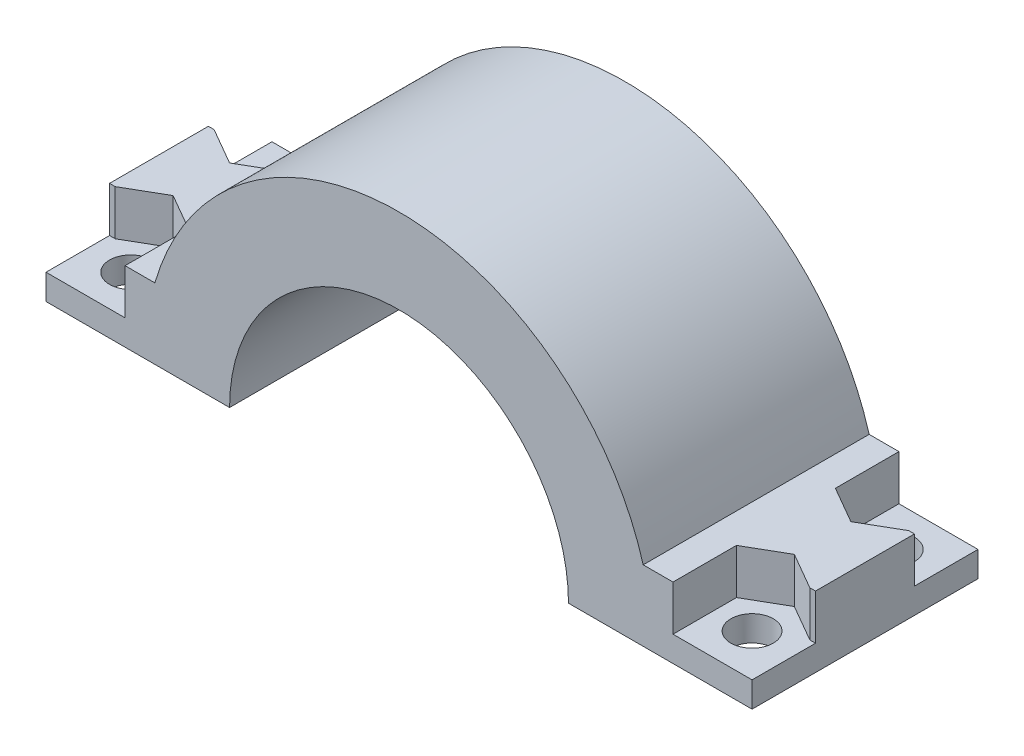
ISO-10303-21;
HEADER;
FILE_DESCRIPTION(('STEP AP214'),'2;1');
FILE_NAME('part.step','',(''),(''),'','','');
FILE_SCHEMA(('AUTOMOTIVE_DESIGN { 1 0 10303 214 1 1 1 1 }'));
ENDSEC;
DATA;
#1=APPLICATION_CONTEXT('core data for automotive mechanical design processes');
#2=APPLICATION_PROTOCOL_DEFINITION('international standard','automotive_design',2000,#1);
#3=PRODUCT_CONTEXT('',#1,'mechanical');
#4=PRODUCT('Part','Part','',(#3));
#5=PRODUCT_RELATED_PRODUCT_CATEGORY('part','',(#4));
#6=PRODUCT_DEFINITION_FORMATION('','',#4);
#7=PRODUCT_DEFINITION_CONTEXT('part definition',#1,'design');
#8=PRODUCT_DEFINITION('design','',#6,#7);
#9=PRODUCT_DEFINITION_SHAPE('','',#8);
#10=(LENGTH_UNIT() NAMED_UNIT(*) SI_UNIT(.MILLI.,.METRE.));
#11=(NAMED_UNIT(*) PLANE_ANGLE_UNIT() SI_UNIT($,.RADIAN.));
#12=(NAMED_UNIT(*) SI_UNIT($,.STERADIAN.) SOLID_ANGLE_UNIT());
#13=UNCERTAINTY_MEASURE_WITH_UNIT(LENGTH_MEASURE(1.E-05),#10,'distance_accuracy_value','');
#14=(GEOMETRIC_REPRESENTATION_CONTEXT(3) GLOBAL_UNCERTAINTY_ASSIGNED_CONTEXT((#13)) GLOBAL_UNIT_ASSIGNED_CONTEXT((#10,
#11,#12)) REPRESENTATION_CONTEXT('',''));
#15=CARTESIAN_POINT('',(0.,0.,0.));
#16=DIRECTION('',(0.,0.,1.));
#17=DIRECTION('',(1.,0.,0.));
#18=AXIS2_PLACEMENT_3D('',#15,#16,#17);
#19=CARTESIAN_POINT('',(-13.4228180941195,-22.1660126804046,16.));
#20=DIRECTION('',(0.,-1.,0.));
#21=DIRECTION('',(0.,0.,-1.));
#22=AXIS2_PLACEMENT_3D('',#19,#20,#21);
#23=PLANE('',#22);
#24=DIRECTION('',(1.,0.,0.));
#25=VECTOR('',#24,1.);
#26=CARTESIAN_POINT('',(21.1604148374617,-22.1660126804046,11.5));
#27=LINE('',#26,#25);
#28=CARTESIAN_POINT('',(-21.1312016283288,-22.1660126804046,11.5));
#29=VERTEX_POINT('',#28);
#30=CARTESIAN_POINT('',(-20.7292778396821,-22.1660126804046,11.5));
#31=VERTEX_POINT('',#30);
#32=EDGE_CURVE('E306',#29,#31,#27,.T.);
#33=ORIENTED_EDGE('',*,*,#32,.T.);
#34=DIRECTION('',(0.866025403784439,0.,-0.5));
#35=VECTOR('',#34,1.);
#36=CARTESIAN_POINT('',(8.73943450966078,-22.1660126804046,-5.51376900756474));
#37=LINE('',#36,#35);
#38=CARTESIAN_POINT('',(-18.1312016283288,-22.1660126804046,10.));
#39=VERTEX_POINT('',#38);
#40=EDGE_CURVE('E310',#31,#39,#37,.T.);
#41=ORIENTED_EDGE('',*,*,#40,.T.);
#42=DIRECTION('',(0.866025403784439,0.,0.5));
#43=VECTOR('',#42,1.);
#44=CARTESIAN_POINT('',(13.9355869323674,-22.1660126804046,28.5137690075648));
#45=LINE('',#44,#43);
#46=CARTESIAN_POINT('',(-15.5331254169755,-22.1660126804046,11.5));
#47=VERTEX_POINT('',#46);
#48=EDGE_CURVE('E315',#39,#47,#45,.T.);
#49=ORIENTED_EDGE('',*,*,#48,.T.);
#50=DIRECTION('',(0.,0.,1.));
#51=VECTOR('',#50,1.);
#52=CARTESIAN_POINT('',(-15.5331254169755,-22.1660126804046,16.));
#53=LINE('',#52,#51);
#54=CARTESIAN_POINT('',(-15.5331254169755,-22.1660126804046,16.));
#55=VERTEX_POINT('',#54);
#56=EDGE_CURVE('E290',#47,#55,#53,.T.);
#57=ORIENTED_EDGE('',*,*,#56,.T.);
#58=DIRECTION('',(-1.,0.,0.));
#59=VECTOR('',#58,1.);
#60=CARTESIAN_POINT('',(-13.4228180941195,-22.1660126804046,16.));
#61=LINE('',#60,#59);
#62=CARTESIAN_POINT('',(-13.4228180941195,-22.1660126804046,16.));
#63=VERTEX_POINT('',#62);
#64=EDGE_CURVE('E445',#63,#55,#61,.T.);
#65=ORIENTED_EDGE('',*,*,#64,.F.);
#66=DIRECTION('',(0.,0.,-1.));
#67=VECTOR('',#66,1.);
#68=CARTESIAN_POINT('',(-13.4228180941195,-22.1660126804046,16.));
#69=LINE('',#68,#67);
#70=CARTESIAN_POINT('',(-13.4228180941195,-22.1660126804046,0.));
#71=VERTEX_POINT('',#70);
#72=EDGE_CURVE('E522',#63,#71,#69,.T.);
#73=ORIENTED_EDGE('',*,*,#72,.T.);
#74=DIRECTION('',(-1.,0.,0.));
#75=VECTOR('',#74,1.);
#76=CARTESIAN_POINT('',(-13.4228180941195,-22.1660126804046,0.));
#77=LINE('',#76,#75);
#78=CARTESIAN_POINT('',(-15.5331254169755,-22.1660126804046,0.));
#79=VERTEX_POINT('',#78);
#80=EDGE_CURVE('E473',#71,#79,#77,.T.);
#81=ORIENTED_EDGE('',*,*,#80,.T.);
#82=DIRECTION('',(0.,0.,1.));
#83=VECTOR('',#82,1.);
#84=CARTESIAN_POINT('',(-15.5331254169755,-22.1660126804046,16.));
#85=LINE('',#84,#83);
#86=CARTESIAN_POINT('',(-15.5331254169755,-22.1660126804046,4.5));
#87=VERTEX_POINT('',#86);
#88=EDGE_CURVE('E337',#79,#87,#85,.T.);
#89=ORIENTED_EDGE('',*,*,#88,.T.);
#90=DIRECTION('',(-0.866025403784439,0.,0.499999999999999));
#91=VECTOR('',#90,1.);
#92=CARTESIAN_POINT('',(7.0073837020919,-22.1660126804046,-8.51376900756478));
#93=LINE('',#92,#91);
#94=CARTESIAN_POINT('',(-18.1312016283289,-22.1660126804046,5.99999999999999));
#95=VERTEX_POINT('',#94);
#96=EDGE_CURVE('E414',#87,#95,#93,.T.);
#97=ORIENTED_EDGE('',*,*,#96,.T.);
#98=DIRECTION('',(-0.866025403784439,0.,-0.5));
#99=VECTOR('',#98,1.);
#100=CARTESIAN_POINT('',(15.6676377399363,-22.1660126804046,25.5137690075648));
#101=LINE('',#100,#99);
#102=CARTESIAN_POINT('',(-20.7292778396822,-22.1660126804046,4.49999999999999));
#103=VERTEX_POINT('',#102);
#104=EDGE_CURVE('E418',#95,#103,#101,.T.);
#105=ORIENTED_EDGE('',*,*,#104,.T.);
#106=DIRECTION('',(-1.,0.,0.));
#107=VECTOR('',#106,1.);
#108=CARTESIAN_POINT('',(21.1604148374617,-22.1660126804046,4.49999999999999));
#109=LINE('',#108,#107);
#110=CARTESIAN_POINT('',(-21.1312016283289,-22.1660126804046,4.49999999999999));
#111=VERTEX_POINT('',#110);
#112=EDGE_CURVE('E394',#103,#111,#109,.T.);
#113=ORIENTED_EDGE('',*,*,#112,.T.);
#114=DIRECTION('',(0.,0.,-1.));
#115=VECTOR('',#114,1.);
#116=CARTESIAN_POINT('',(-21.1312016283289,-22.1660126804046,16.));
#117=LINE('',#116,#115);
#118=EDGE_CURVE('E518',#29,#111,#117,.T.);
#119=ORIENTED_EDGE('',*,*,#118,.F.);
#120=EDGE_LOOP('',(#33,#41,#49,#57,#65,#73,#81,#89,#97,#105,#113,#119));
#121=FACE_BOUND('',#120,.T.);
#122=ADVANCED_FACE('F41',(#121),#23,.F.);
#123=CARTESIAN_POINT('',(-21.1312016283289,-22.1660126804046,16.));
#124=DIRECTION('',(1.,0.,0.));
#125=DIRECTION('',(0.,1.,0.));
#126=AXIS2_PLACEMENT_3D('',#123,#124,#125);
#127=PLANE('',#126);
#128=DIRECTION('',(0.,1.,0.));
#129=VECTOR('',#128,1.);
#130=CARTESIAN_POINT('',(-21.1312016283288,-25.3660126804046,11.5));
#131=LINE('',#130,#129);
#132=CARTESIAN_POINT('',(-21.1312016283288,-25.3660126804046,11.5));
#133=VERTEX_POINT('',#132);
#134=EDGE_CURVE('E330',#133,#29,#131,.T.);
#135=ORIENTED_EDGE('',*,*,#134,.T.);
#136=ORIENTED_EDGE('',*,*,#118,.T.);
#137=DIRECTION('',(0.,1.,0.));
#138=VECTOR('',#137,1.);
#139=CARTESIAN_POINT('',(-21.1312016283289,-25.3660126804046,4.49999999999999));
#140=LINE('',#139,#138);
#141=CARTESIAN_POINT('',(-21.1312016283289,-25.3660126804046,4.49999999999999));
#142=VERTEX_POINT('',#141);
#143=EDGE_CURVE('E410',#142,#111,#140,.T.);
#144=ORIENTED_EDGE('',*,*,#143,.F.);
#145=DIRECTION('',(0.,0.,-1.));
#146=VECTOR('',#145,1.);
#147=CARTESIAN_POINT('',(-21.1312016283289,-25.3660126804046,16.));
#148=LINE('',#147,#146);
#149=CARTESIAN_POINT('',(-21.1312016283288,-25.3660126804046,0.));
#150=VERTEX_POINT('',#149);
#151=EDGE_CURVE('E389',#142,#150,#148,.T.);
#152=ORIENTED_EDGE('',*,*,#151,.T.);
#153=DIRECTION('',(0.,-1.,0.));
#154=VECTOR('',#153,1.);
#155=CARTESIAN_POINT('',(-21.1312016283289,-22.1660126804046,0.));
#156=LINE('',#155,#154);
#157=CARTESIAN_POINT('',(-21.1312016283289,-27.1660126804046,0.));
#158=VERTEX_POINT('',#157);
#159=EDGE_CURVE('E477',#150,#158,#156,.T.);
#160=ORIENTED_EDGE('',*,*,#159,.T.);
#161=DIRECTION('',(0.,0.,-1.));
#162=VECTOR('',#161,1.);
#163=CARTESIAN_POINT('',(-21.1312016283289,-27.1660126804046,16.));
#164=LINE('',#163,#162);
#165=CARTESIAN_POINT('',(-21.1312016283289,-27.1660126804046,16.));
#166=VERTEX_POINT('',#165);
#167=EDGE_CURVE('E514',#166,#158,#164,.T.);
#168=ORIENTED_EDGE('',*,*,#167,.F.);
#169=DIRECTION('',(0.,-1.,0.));
#170=VECTOR('',#169,1.);
#171=CARTESIAN_POINT('',(-21.1312016283289,-22.1660126804046,16.));
#172=LINE('',#171,#170);
#173=CARTESIAN_POINT('',(-21.1312016283289,-25.3660126804046,16.));
#174=VERTEX_POINT('',#173);
#175=EDGE_CURVE('E450',#174,#166,#172,.T.);
#176=ORIENTED_EDGE('',*,*,#175,.F.);
#177=DIRECTION('',(0.,0.,-1.));
#178=VECTOR('',#177,1.);
#179=CARTESIAN_POINT('',(-21.1312016283288,-25.3660126804046,16.));
#180=LINE('',#179,#178);
#181=EDGE_CURVE('E67',#174,#133,#180,.T.);
#182=ORIENTED_EDGE('',*,*,#181,.T.);
#183=EDGE_LOOP('',(#135,#136,#144,#152,#160,#168,#176,#182));
#184=FACE_BOUND('',#183,.T.);
#185=ADVANCED_FACE('F576',(#184),#127,.F.);
#186=CARTESIAN_POINT('',(28.8687983716711,-27.1660126804046,16.));
#187=DIRECTION('',(-1.,0.,0.));
#188=DIRECTION('',(0.,-1.,0.));
#189=AXIS2_PLACEMENT_3D('',#186,#187,#188);
#190=PLANE('',#189);
#191=DIRECTION('',(0.,1.,0.));
#192=VECTOR('',#191,1.);
#193=CARTESIAN_POINT('',(28.8687983716711,-25.3660126804046,4.49999999999999));
#194=LINE('',#193,#192);
#195=CARTESIAN_POINT('',(28.8687983716711,-25.3660126804046,4.49999999999999));
#196=VERTEX_POINT('',#195);
#197=CARTESIAN_POINT('',(28.8687983716711,-22.1660126804046,4.49999999999999));
#198=VERTEX_POINT('',#197);
#199=EDGE_CURVE('E311',#196,#198,#194,.T.);
#200=ORIENTED_EDGE('',*,*,#199,.T.);
#201=DIRECTION('',(0.,0.,-1.));
#202=VECTOR('',#201,1.);
#203=CARTESIAN_POINT('',(28.8687983716711,-22.1660126804046,16.));
#204=LINE('',#203,#202);
#205=CARTESIAN_POINT('',(28.8687983716711,-22.1660126804046,11.506491478641));
#206=VERTEX_POINT('',#205);
#207=EDGE_CURVE('E498',#206,#198,#204,.T.);
#208=ORIENTED_EDGE('',*,*,#207,.F.);
#209=DIRECTION('',(0.,1.,0.));
#210=VECTOR('',#209,1.);
#211=CARTESIAN_POINT('',(28.8687983716711,-25.3660126804046,11.506491478641));
#212=LINE('',#211,#210);
#213=CARTESIAN_POINT('',(28.8687983716711,-25.3660126804046,11.506491478641));
#214=VERTEX_POINT('',#213);
#215=EDGE_CURVE('E264',#214,#206,#212,.T.);
#216=ORIENTED_EDGE('',*,*,#215,.F.);
#217=DIRECTION('',(0.,0.,1.));
#218=VECTOR('',#217,1.);
#219=CARTESIAN_POINT('',(28.8687983716711,-25.3660126804046,16.));
#220=LINE('',#219,#218);
#221=CARTESIAN_POINT('',(28.8687983716711,-25.3660126804046,16.));
#222=VERTEX_POINT('',#221);
#223=EDGE_CURVE('E260',#214,#222,#220,.T.);
#224=ORIENTED_EDGE('',*,*,#223,.T.);
#225=DIRECTION('',(0.,1.,0.));
#226=VECTOR('',#225,1.);
#227=CARTESIAN_POINT('',(28.8687983716711,-27.1660126804046,16.));
#228=LINE('',#227,#226);
#229=CARTESIAN_POINT('',(28.8687983716711,-27.1660126804046,16.));
#230=VERTEX_POINT('',#229);
#231=EDGE_CURVE('E462',#230,#222,#228,.T.);
#232=ORIENTED_EDGE('',*,*,#231,.F.);
#233=DIRECTION('',(0.,0.,-1.));
#234=VECTOR('',#233,1.);
#235=CARTESIAN_POINT('',(28.8687983716711,-27.1660126804046,16.));
#236=LINE('',#235,#234);
#237=CARTESIAN_POINT('',(28.8687983716711,-27.1660126804046,0.));
#238=VERTEX_POINT('',#237);
#239=EDGE_CURVE('E502',#230,#238,#236,.T.);
#240=ORIENTED_EDGE('',*,*,#239,.T.);
#241=DIRECTION('',(0.,1.,0.));
#242=VECTOR('',#241,1.);
#243=CARTESIAN_POINT('',(28.8687983716711,-27.1660126804046,0.));
#244=LINE('',#243,#242);
#245=CARTESIAN_POINT('',(28.8687983716711,-25.3660126804046,0.));
#246=VERTEX_POINT('',#245);
#247=EDGE_CURVE('E489',#238,#246,#244,.T.);
#248=ORIENTED_EDGE('',*,*,#247,.T.);
#249=DIRECTION('',(0.,0.,1.));
#250=VECTOR('',#249,1.);
#251=CARTESIAN_POINT('',(28.8687983716711,-25.3660126804046,16.));
#252=LINE('',#251,#250);
#253=EDGE_CURVE('E338',#246,#196,#252,.T.);
#254=ORIENTED_EDGE('',*,*,#253,.T.);
#255=EDGE_LOOP('',(#200,#208,#216,#224,#232,#240,#248,#254));
#256=FACE_BOUND('',#255,.T.);
#257=ADVANCED_FACE('F581',(#256),#190,.F.);
#258=CARTESIAN_POINT('',(21.1604148374617,-22.1660126804046,16.));
#259=DIRECTION('',(0.,-1.,0.));
#260=DIRECTION('',(0.,0.,-1.));
#261=AXIS2_PLACEMENT_3D('',#258,#259,#260);
#262=PLANE('',#261);
#263=DIRECTION('',(-1.,0.,0.));
#264=VECTOR('',#263,1.);
#265=CARTESIAN_POINT('',(21.1604148374617,-22.1660126804046,4.49999999999999));
#266=LINE('',#265,#264);
#267=CARTESIAN_POINT('',(28.4668745830244,-22.1660126804046,4.49999999999999));
#268=VERTEX_POINT('',#267);
#269=EDGE_CURVE('E244',#198,#268,#266,.T.);
#270=ORIENTED_EDGE('',*,*,#269,.T.);
#271=DIRECTION('',(-0.866025403784439,0.,0.5));
#272=VECTOR('',#271,1.);
#273=CARTESIAN_POINT('',(18.0073837020919,-22.1660126804046,10.5387898756928));
#274=LINE('',#273,#272);
#275=CARTESIAN_POINT('',(25.8687983716711,-22.1660126804046,5.99999999999999));
#276=VERTEX_POINT('',#275);
#277=EDGE_CURVE('E363',#268,#276,#274,.T.);
#278=ORIENTED_EDGE('',*,*,#277,.T.);
#279=DIRECTION('',(-0.866025403784439,0.,-0.5));
#280=VECTOR('',#279,1.);
#281=CARTESIAN_POINT('',(26.6676377399363,-22.1660126804046,6.46121012430714));
#282=LINE('',#281,#280);
#283=CARTESIAN_POINT('',(23.2707221603178,-22.1660126804046,4.5));
#284=VERTEX_POINT('',#283);
#285=EDGE_CURVE('E367',#276,#284,#282,.T.);
#286=ORIENTED_EDGE('',*,*,#285,.T.);
#287=DIRECTION('',(0.,0.,-1.));
#288=VECTOR('',#287,1.);
#289=CARTESIAN_POINT('',(23.2707221603178,-22.1660126804046,16.));
#290=LINE('',#289,#288);
#291=CARTESIAN_POINT('',(23.2707221603178,-22.1660126804046,0.));
#292=VERTEX_POINT('',#291);
#293=EDGE_CURVE('E343',#284,#292,#290,.T.);
#294=ORIENTED_EDGE('',*,*,#293,.T.);
#295=DIRECTION('',(-1.,0.,0.));
#296=VECTOR('',#295,1.);
#297=CARTESIAN_POINT('',(21.1604148374617,-22.1660126804046,0.));
#298=LINE('',#297,#296);
#299=CARTESIAN_POINT('',(21.1604148374617,-22.1660126804046,0.));
#300=VERTEX_POINT('',#299);
#301=EDGE_CURVE('E446',#292,#300,#298,.T.);
#302=ORIENTED_EDGE('',*,*,#301,.T.);
#303=DIRECTION('',(0.,0.,-1.));
#304=VECTOR('',#303,1.);
#305=CARTESIAN_POINT('',(21.1604148374617,-22.1660126804046,16.));
#306=LINE('',#305,#304);
#307=CARTESIAN_POINT('',(21.1604148374617,-22.1660126804046,16.));
#308=VERTEX_POINT('',#307);
#309=EDGE_CURVE('E469',#308,#300,#306,.T.);
#310=ORIENTED_EDGE('',*,*,#309,.F.);
#311=DIRECTION('',(-1.,0.,0.));
#312=VECTOR('',#311,1.);
#313=CARTESIAN_POINT('',(21.1604148374617,-22.1660126804046,16.));
#314=LINE('',#313,#312);
#315=CARTESIAN_POINT('',(23.2707221603178,-22.1660126804046,16.));
#316=VERTEX_POINT('',#315);
#317=EDGE_CURVE('E466',#316,#308,#314,.T.);
#318=ORIENTED_EDGE('',*,*,#317,.F.);
#319=DIRECTION('',(0.,0.,-1.));
#320=VECTOR('',#319,1.);
#321=CARTESIAN_POINT('',(23.2707221603178,-22.1660126804046,16.));
#322=LINE('',#321,#320);
#323=CARTESIAN_POINT('',(23.2707221603178,-22.1660126804046,11.506491478641));
#324=VERTEX_POINT('',#323);
#325=EDGE_CURVE('E265',#316,#324,#322,.T.);
#326=ORIENTED_EDGE('',*,*,#325,.T.);
#327=DIRECTION('',(0.866025403784439,0.,-0.5));
#328=VECTOR('',#327,1.);
#329=CARTESIAN_POINT('',(19.7422454023664,-22.1660126804046,13.5436584846736));
#330=LINE('',#329,#328);
#331=CARTESIAN_POINT('',(25.8687983716711,-22.1660126804046,10.006491478641));
#332=VERTEX_POINT('',#331);
#333=EDGE_CURVE('E241',#324,#332,#330,.T.);
#334=ORIENTED_EDGE('',*,*,#333,.T.);
#335=DIRECTION('',(0.866025403784439,0.,0.5));
#336=VECTOR('',#335,1.);
#337=CARTESIAN_POINT('',(24.9327760396617,-22.1660126804046,9.4660787332879));
#338=LINE('',#337,#336);
#339=CARTESIAN_POINT('',(28.4668745830245,-22.1660126804046,11.506491478641));
#340=VERTEX_POINT('',#339);
#341=EDGE_CURVE('E271',#332,#340,#338,.T.);
#342=ORIENTED_EDGE('',*,*,#341,.T.);
#343=DIRECTION('',(1.,0.,0.));
#344=VECTOR('',#343,1.);
#345=CARTESIAN_POINT('',(21.1604148374617,-22.1660126804046,11.506491478641));
#346=LINE('',#345,#344);
#347=EDGE_CURVE('E235',#340,#206,#346,.T.);
#348=ORIENTED_EDGE('',*,*,#347,.T.);
#349=ORIENTED_EDGE('',*,*,#207,.T.);
#350=EDGE_LOOP('',(#270,#278,#286,#294,#302,#310,#318,#326,#334,#342,#348,#349));
#351=FACE_BOUND('',#350,.T.);
#352=ADVANCED_FACE('F600',(#351),#262,.F.);
#353=CARTESIAN_POINT('',(3.86879837167112,-27.1660126804046,16.));
#354=DIRECTION('',(0.,0.,1.));
#355=DIRECTION('',(1.,0.,0.));
#356=AXIS2_PLACEMENT_3D('',#353,#354,#355);
#357=PLANE('',#356);
#358=ORIENTED_EDGE('',*,*,#64,.T.);
#359=DIRECTION('',(0.,1.,0.));
#360=VECTOR('',#359,1.);
#361=CARTESIAN_POINT('',(-15.5331254169755,-25.3660126804046,16.));
#362=LINE('',#361,#360);
#363=CARTESIAN_POINT('',(-15.5331254169755,-25.3660126804046,16.));
#364=VERTEX_POINT('',#363);
#365=EDGE_CURVE('E334',#364,#55,#362,.T.);
#366=ORIENTED_EDGE('',*,*,#365,.F.);
#367=DIRECTION('',(-1.,0.,0.));
#368=VECTOR('',#367,1.);
#369=CARTESIAN_POINT('',(21.1604148374617,-25.3660126804046,16.));
#370=LINE('',#369,#368);
#371=EDGE_CURVE('E289',#364,#174,#370,.T.);
#372=ORIENTED_EDGE('',*,*,#371,.T.);
#373=ORIENTED_EDGE('',*,*,#175,.T.);
#374=DIRECTION('',(1.,0.,0.));
#375=VECTOR('',#374,1.);
#376=CARTESIAN_POINT('',(-21.1312016283289,-27.1660126804046,16.));
#377=LINE('',#376,#375);
#378=CARTESIAN_POINT('',(-8.13120162832888,-27.1660126804046,16.));
#379=VERTEX_POINT('',#378);
#380=EDGE_CURVE('E453',#166,#379,#377,.T.);
#381=ORIENTED_EDGE('',*,*,#380,.T.);
#382=CARTESIAN_POINT('',(3.86879837167112,-27.1660126804046,16.));
#383=DIRECTION('',(0.,0.,-1.));
#384=DIRECTION('',(-1.,0.,0.));
#385=AXIS2_PLACEMENT_3D('',#382,#383,#384);
#386=CIRCLE('',#385,12.);
#387=CARTESIAN_POINT('',(15.8687983716711,-27.1660126804046,16.));
#388=VERTEX_POINT('',#387);
#389=EDGE_CURVE('E456',#379,#388,#386,.T.);
#390=ORIENTED_EDGE('',*,*,#389,.T.);
#391=DIRECTION('',(1.,0.,0.));
#392=VECTOR('',#391,1.);
#393=CARTESIAN_POINT('',(15.8687983716711,-27.1660126804046,16.));
#394=LINE('',#393,#392);
#395=EDGE_CURVE('E459',#388,#230,#394,.T.);
#396=ORIENTED_EDGE('',*,*,#395,.T.);
#397=ORIENTED_EDGE('',*,*,#231,.T.);
#398=DIRECTION('',(1.,0.,0.));
#399=VECTOR('',#398,1.);
#400=CARTESIAN_POINT('',(3.86879837167112,-25.3660126804046,16.));
#401=LINE('',#400,#399);
#402=CARTESIAN_POINT('',(23.2707221603178,-25.3660126804046,16.));
#403=VERTEX_POINT('',#402);
#404=EDGE_CURVE('E51',#403,#222,#401,.T.);
#405=ORIENTED_EDGE('',*,*,#404,.F.);
#406=DIRECTION('',(0.,1.,0.));
#407=VECTOR('',#406,1.);
#408=CARTESIAN_POINT('',(23.2707221603178,-27.1660126804046,16.));
#409=LINE('',#408,#407);
#410=EDGE_CURVE('E11',#403,#316,#409,.T.);
#411=ORIENTED_EDGE('',*,*,#410,.T.);
#412=ORIENTED_EDGE('',*,*,#317,.T.);
#413=CARTESIAN_POINT('',(3.86879837167112,-27.1660126804046,16.));
#414=DIRECTION('',(0.,0.,1.));
#415=DIRECTION('',(1.,0.,0.));
#416=AXIS2_PLACEMENT_3D('',#413,#414,#415);
#417=CIRCLE('',#416,18.);
#418=EDGE_CURVE('E441',#308,#63,#417,.T.);
#419=ORIENTED_EDGE('',*,*,#418,.T.);
#420=EDGE_LOOP('',(#358,#366,#372,#373,#381,#390,#396,#397,#405,#411,#412,#419));
#421=FACE_BOUND('',#420,.T.);
#422=ADVANCED_FACE('F604',(#421),#357,.T.);
#423=CARTESIAN_POINT('',(3.86879837167112,-27.1660126804046,0.));
#424=DIRECTION('',(0.,0.,1.));
#425=DIRECTION('',(1.,0.,0.));
#426=AXIS2_PLACEMENT_3D('',#423,#424,#425);
#427=PLANE('',#426);
#428=DIRECTION('',(0.,1.,0.));
#429=VECTOR('',#428,1.);
#430=CARTESIAN_POINT('',(23.2707221603178,-25.3660126804046,0.));
#431=LINE('',#430,#429);
#432=CARTESIAN_POINT('',(23.2707221603178,-25.3660126804046,0.));
#433=VERTEX_POINT('',#432);
#434=EDGE_CURVE('E359',#433,#292,#431,.T.);
#435=ORIENTED_EDGE('',*,*,#434,.F.);
#436=DIRECTION('',(1.,0.,0.));
#437=VECTOR('',#436,1.);
#438=CARTESIAN_POINT('',(21.1604148374617,-25.3660126804046,0.));
#439=LINE('',#438,#437);
#440=EDGE_CURVE('E355',#433,#246,#439,.T.);
#441=ORIENTED_EDGE('',*,*,#440,.T.);
#442=ORIENTED_EDGE('',*,*,#247,.F.);
#443=DIRECTION('',(1.,0.,0.));
#444=VECTOR('',#443,1.);
#445=CARTESIAN_POINT('',(15.8687983716711,-27.1660126804046,0.));
#446=LINE('',#445,#444);
#447=CARTESIAN_POINT('',(15.8687983716711,-27.1660126804046,0.));
#448=VERTEX_POINT('',#447);
#449=EDGE_CURVE('E486',#448,#238,#446,.T.);
#450=ORIENTED_EDGE('',*,*,#449,.F.);
#451=CARTESIAN_POINT('',(3.86879837167112,-27.1660126804046,0.));
#452=DIRECTION('',(0.,0.,-1.));
#453=DIRECTION('',(-1.,0.,0.));
#454=AXIS2_PLACEMENT_3D('',#451,#452,#453);
#455=CIRCLE('',#454,12.);
#456=CARTESIAN_POINT('',(-8.13120162832888,-27.1660126804046,0.));
#457=VERTEX_POINT('',#456);
#458=EDGE_CURVE('E483',#457,#448,#455,.T.);
#459=ORIENTED_EDGE('',*,*,#458,.F.);
#460=DIRECTION('',(1.,0.,0.));
#461=VECTOR('',#460,1.);
#462=CARTESIAN_POINT('',(-21.1312016283289,-27.1660126804046,0.));
#463=LINE('',#462,#461);
#464=EDGE_CURVE('E480',#158,#457,#463,.T.);
#465=ORIENTED_EDGE('',*,*,#464,.F.);
#466=ORIENTED_EDGE('',*,*,#159,.F.);
#467=DIRECTION('',(1.,0.,0.));
#468=VECTOR('',#467,1.);
#469=CARTESIAN_POINT('',(21.1604148374617,-25.3660126804046,0.));
#470=LINE('',#469,#468);
#471=CARTESIAN_POINT('',(-15.5331254169755,-25.3660126804046,0.));
#472=VERTEX_POINT('',#471);
#473=EDGE_CURVE('E393',#150,#472,#470,.T.);
#474=ORIENTED_EDGE('',*,*,#473,.T.);
#475=DIRECTION('',(0.,1.,0.));
#476=VECTOR('',#475,1.);
#477=CARTESIAN_POINT('',(-15.5331254169755,-25.3660126804046,0.));
#478=LINE('',#477,#476);
#479=EDGE_CURVE('E436',#472,#79,#478,.T.);
#480=ORIENTED_EDGE('',*,*,#479,.T.);
#481=ORIENTED_EDGE('',*,*,#80,.F.);
#482=CARTESIAN_POINT('',(3.86879837167112,-27.1660126804046,0.));
#483=DIRECTION('',(0.,0.,1.));
#484=DIRECTION('',(1.,0.,0.));
#485=AXIS2_PLACEMENT_3D('',#482,#483,#484);
#486=CIRCLE('',#485,18.);
#487=EDGE_CURVE('E440',#300,#71,#486,.T.);
#488=ORIENTED_EDGE('',*,*,#487,.F.);
#489=ORIENTED_EDGE('',*,*,#301,.F.);
#490=EDGE_LOOP('',(#435,#441,#442,#450,#459,#465,#466,#474,#480,#481,#488,#489));
#491=FACE_BOUND('',#490,.T.);
#492=ADVANCED_FACE('F606',(#491),#427,.F.);
#493=CARTESIAN_POINT('',(3.86879837167112,-27.1660126804046,16.));
#494=DIRECTION('',(0.,0.,-1.));
#495=DIRECTION('',(-1.,0.,0.));
#496=AXIS2_PLACEMENT_3D('',#493,#494,#495);
#497=CYLINDRICAL_SURFACE('',#496,18.);
#498=ORIENTED_EDGE('',*,*,#487,.T.);
#499=ORIENTED_EDGE('',*,*,#72,.F.);
#500=ORIENTED_EDGE('',*,*,#418,.F.);
#501=ORIENTED_EDGE('',*,*,#309,.T.);
#502=EDGE_LOOP('',(#498,#499,#500,#501));
#503=FACE_BOUND('',#502,.T.);
#504=ADVANCED_FACE('F43',(#503),#497,.T.);
#505=CARTESIAN_POINT('',(-21.1312016283289,-27.1660126804046,16.));
#506=DIRECTION('',(0.,1.,0.));
#507=DIRECTION('',(0.,0.,1.));
#508=AXIS2_PLACEMENT_3D('',#505,#506,#507);
#509=PLANE('',#508);
#510=CARTESIAN_POINT('',(-18.1312016283289,-27.1660126804046,13.));
#511=DIRECTION('',(0.,1.,0.));
#512=DIRECTION('',(0.,0.,1.));
#513=AXIS2_PLACEMENT_3D('',#510,#511,#512);
#514=CIRCLE('',#513,1.5);
#515=CARTESIAN_POINT('',(-18.1312016283289,-27.1660126804046,14.5));
#516=VERTEX_POINT('',#515);
#517=EDGE_CURVE('E532',#516,#516,#514,.T.);
#518=ORIENTED_EDGE('',*,*,#517,.T.);
#519=EDGE_LOOP('',(#518));
#520=FACE_BOUND('',#519,.T.);
#521=CARTESIAN_POINT('',(-18.1312016283289,-27.1660126804046,3.));
#522=DIRECTION('',(0.,1.,0.));
#523=DIRECTION('',(0.,0.,1.));
#524=AXIS2_PLACEMENT_3D('',#521,#522,#523);
#525=CIRCLE('',#524,1.5);
#526=CARTESIAN_POINT('',(-18.1312016283289,-27.1660126804046,4.5));
#527=VERTEX_POINT('',#526);
#528=EDGE_CURVE('E268',#527,#527,#525,.T.);
#529=ORIENTED_EDGE('',*,*,#528,.T.);
#530=EDGE_LOOP('',(#529));
#531=FACE_BOUND('',#530,.T.);
#532=ORIENTED_EDGE('',*,*,#464,.T.);
#533=DIRECTION('',(0.,0.,-1.));
#534=VECTOR('',#533,1.);
#535=CARTESIAN_POINT('',(-8.13120162832888,-27.1660126804046,16.));
#536=LINE('',#535,#534);
#537=EDGE_CURVE('E510',#379,#457,#536,.T.);
#538=ORIENTED_EDGE('',*,*,#537,.F.);
#539=ORIENTED_EDGE('',*,*,#380,.F.);
#540=ORIENTED_EDGE('',*,*,#167,.T.);
#541=EDGE_LOOP('',(#532,#538,#539,#540));
#542=FACE_BOUND('',#541,.T.);
#543=ADVANCED_FACE('F585',(#520,#531,#542),#509,.F.);
#544=CARTESIAN_POINT('',(3.86879837167112,-27.1660126804046,16.));
#545=DIRECTION('',(0.,0.,-1.));
#546=DIRECTION('',(-1.,0.,0.));
#547=AXIS2_PLACEMENT_3D('',#544,#545,#546);
#548=CYLINDRICAL_SURFACE('',#547,12.);
#549=ORIENTED_EDGE('',*,*,#458,.T.);
#550=DIRECTION('',(0.,0.,-1.));
#551=VECTOR('',#550,1.);
#552=CARTESIAN_POINT('',(15.8687983716711,-27.1660126804046,16.));
#553=LINE('',#552,#551);
#554=EDGE_CURVE('E506',#388,#448,#553,.T.);
#555=ORIENTED_EDGE('',*,*,#554,.F.);
#556=ORIENTED_EDGE('',*,*,#389,.F.);
#557=ORIENTED_EDGE('',*,*,#537,.T.);
#558=EDGE_LOOP('',(#549,#555,#556,#557));
#559=FACE_BOUND('',#558,.T.);
#560=ADVANCED_FACE('F588',(#559),#548,.F.);
#561=CARTESIAN_POINT('',(15.8687983716711,-27.1660126804046,16.));
#562=DIRECTION('',(0.,1.,0.));
#563=DIRECTION('',(0.,0.,1.));
#564=AXIS2_PLACEMENT_3D('',#561,#562,#563);
#565=PLANE('',#564);
#566=CARTESIAN_POINT('',(25.8687983716711,-27.1660126804046,3.));
#567=DIRECTION('',(0.,1.,0.));
#568=DIRECTION('',(0.,0.,1.));
#569=AXIS2_PLACEMENT_3D('',#566,#567,#568);
#570=CIRCLE('',#569,1.5);
#571=CARTESIAN_POINT('',(25.8687983716711,-27.1660126804046,4.5));
#572=VERTEX_POINT('',#571);
#573=EDGE_CURVE('E540',#572,#572,#570,.T.);
#574=ORIENTED_EDGE('',*,*,#573,.T.);
#575=EDGE_LOOP('',(#574));
#576=FACE_BOUND('',#575,.T.);
#577=CARTESIAN_POINT('',(25.8687983716711,-27.1660126804046,13.));
#578=DIRECTION('',(0.,1.,0.));
#579=DIRECTION('',(0.,0.,1.));
#580=AXIS2_PLACEMENT_3D('',#577,#578,#579);
#581=CIRCLE('',#580,1.5);
#582=CARTESIAN_POINT('',(25.8687983716711,-27.1660126804046,14.5));
#583=VERTEX_POINT('',#582);
#584=EDGE_CURVE('E536',#583,#583,#581,.T.);
#585=ORIENTED_EDGE('',*,*,#584,.T.);
#586=EDGE_LOOP('',(#585));
#587=FACE_BOUND('',#586,.T.);
#588=ORIENTED_EDGE('',*,*,#449,.T.);
#589=ORIENTED_EDGE('',*,*,#239,.F.);
#590=ORIENTED_EDGE('',*,*,#395,.F.);
#591=ORIENTED_EDGE('',*,*,#554,.T.);
#592=EDGE_LOOP('',(#588,#589,#590,#591));
#593=FACE_BOUND('',#592,.T.);
#594=ADVANCED_FACE('F592',(#576,#587,#593),#565,.F.);
#595=CARTESIAN_POINT('',(-15.5331254169755,-25.3660126804046,16.));
#596=DIRECTION('',(-1.,0.,0.));
#597=DIRECTION('',(0.,0.,1.));
#598=AXIS2_PLACEMENT_3D('',#595,#596,#597);
#599=PLANE('',#598);
#600=ORIENTED_EDGE('',*,*,#88,.F.);
#601=ORIENTED_EDGE('',*,*,#479,.F.);
#602=DIRECTION('',(0.,0.,1.));
#603=VECTOR('',#602,1.);
#604=CARTESIAN_POINT('',(-15.5331254169755,-25.3660126804046,16.));
#605=LINE('',#604,#603);
#606=CARTESIAN_POINT('',(-15.5331254169755,-25.3660126804046,4.5));
#607=VERTEX_POINT('',#606);
#608=EDGE_CURVE('E398',#472,#607,#605,.T.);
#609=ORIENTED_EDGE('',*,*,#608,.T.);
#610=DIRECTION('',(0.,1.,0.));
#611=VECTOR('',#610,1.);
#612=CARTESIAN_POINT('',(-15.5331254169755,-25.3660126804046,4.5));
#613=LINE('',#612,#611);
#614=EDGE_CURVE('E433',#607,#87,#613,.T.);
#615=ORIENTED_EDGE('',*,*,#614,.T.);
#616=EDGE_LOOP('',(#600,#601,#609,#615));
#617=FACE_BOUND('',#616,.T.);
#618=ADVANCED_FACE('F596',(#617),#599,.T.);
#619=CARTESIAN_POINT('',(7.0073837020919,-25.3660126804046,-8.51376900756478));
#620=DIRECTION('',(-0.499999999999999,0.,-0.866025403784439));
#621=DIRECTION('',(-0.866025403784439,0.,0.499999999999999));
#622=AXIS2_PLACEMENT_3D('',#619,#620,#621);
#623=PLANE('',#622);
#624=ORIENTED_EDGE('',*,*,#96,.F.);
#625=ORIENTED_EDGE('',*,*,#614,.F.);
#626=DIRECTION('',(-0.866025403784439,0.,0.499999999999999));
#627=VECTOR('',#626,1.);
#628=CARTESIAN_POINT('',(7.0073837020919,-25.3660126804046,-8.51376900756478));
#629=LINE('',#628,#627);
#630=CARTESIAN_POINT('',(-18.1312016283289,-25.3660126804046,5.99999999999999));
#631=VERTEX_POINT('',#630);
#632=EDGE_CURVE('E401',#607,#631,#629,.T.);
#633=ORIENTED_EDGE('',*,*,#632,.T.);
#634=DIRECTION('',(0.,1.,0.));
#635=VECTOR('',#634,1.);
#636=CARTESIAN_POINT('',(-18.1312016283289,-25.3660126804046,5.99999999999999));
#637=LINE('',#636,#635);
#638=EDGE_CURVE('E430',#631,#95,#637,.T.);
#639=ORIENTED_EDGE('',*,*,#638,.T.);
#640=EDGE_LOOP('',(#624,#625,#633,#639));
#641=FACE_BOUND('',#640,.T.);
#642=ADVANCED_FACE('F615',(#641),#623,.T.);
#643=CARTESIAN_POINT('',(15.6676377399363,-25.3660126804046,25.5137690075648));
#644=DIRECTION('',(0.5,0.,-0.866025403784438));
#645=DIRECTION('',(-0.866025403784439,0.,-0.5));
#646=AXIS2_PLACEMENT_3D('',#643,#644,#645);
#647=PLANE('',#646);
#648=ORIENTED_EDGE('',*,*,#104,.F.);
#649=ORIENTED_EDGE('',*,*,#638,.F.);
#650=DIRECTION('',(-0.866025403784439,0.,-0.5));
#651=VECTOR('',#650,1.);
#652=CARTESIAN_POINT('',(15.6676377399363,-25.3660126804046,25.5137690075648));
#653=LINE('',#652,#651);
#654=CARTESIAN_POINT('',(-20.7292778396822,-25.3660126804046,4.49999999999999));
#655=VERTEX_POINT('',#654);
#656=EDGE_CURVE('E404',#631,#655,#653,.T.);
#657=ORIENTED_EDGE('',*,*,#656,.T.);
#658=DIRECTION('',(0.,1.,0.));
#659=VECTOR('',#658,1.);
#660=CARTESIAN_POINT('',(-20.7292778396822,-25.3660126804046,4.49999999999999));
#661=LINE('',#660,#659);
#662=EDGE_CURVE('E427',#655,#103,#661,.T.);
#663=ORIENTED_EDGE('',*,*,#662,.T.);
#664=EDGE_LOOP('',(#648,#649,#657,#663));
#665=FACE_BOUND('',#664,.T.);
#666=ADVANCED_FACE('F619',(#665),#647,.T.);
#667=CARTESIAN_POINT('',(21.1604148374617,-25.3660126804046,4.49999999999999));
#668=DIRECTION('',(0.,0.,-1.));
#669=DIRECTION('',(-1.,0.,0.));
#670=AXIS2_PLACEMENT_3D('',#667,#668,#669);
#671=PLANE('',#670);
#672=ORIENTED_EDGE('',*,*,#112,.F.);
#673=ORIENTED_EDGE('',*,*,#662,.F.);
#674=DIRECTION('',(-1.,0.,0.));
#675=VECTOR('',#674,1.);
#676=CARTESIAN_POINT('',(21.1604148374617,-25.3660126804046,4.49999999999999));
#677=LINE('',#676,#675);
#678=EDGE_CURVE('E407',#655,#142,#677,.T.);
#679=ORIENTED_EDGE('',*,*,#678,.T.);
#680=ORIENTED_EDGE('',*,*,#143,.T.);
#681=EDGE_LOOP('',(#672,#673,#679,#680));
#682=FACE_BOUND('',#681,.T.);
#683=ADVANCED_FACE('F623',(#682),#671,.T.);
#684=CARTESIAN_POINT('',(0.,-25.3660126804046,0.));
#685=DIRECTION('',(0.,-1.,0.));
#686=DIRECTION('',(0.,0.,-1.));
#687=AXIS2_PLACEMENT_3D('',#684,#685,#686);
#688=PLANE('',#687);
#689=CARTESIAN_POINT('',(-18.1312016283289,-25.3660126804046,3.));
#690=DIRECTION('',(0.,-1.,0.));
#691=DIRECTION('',(0.,0.,-1.));
#692=AXIS2_PLACEMENT_3D('',#689,#690,#691);
#693=CIRCLE('',#692,1.5);
#694=CARTESIAN_POINT('',(-18.1312016283289,-25.3660126804046,1.5));
#695=VERTEX_POINT('',#694);
#696=EDGE_CURVE('E45',#695,#695,#693,.T.);
#697=ORIENTED_EDGE('',*,*,#696,.T.);
#698=EDGE_LOOP('',(#697));
#699=FACE_BOUND('',#698,.T.);
#700=ORIENTED_EDGE('',*,*,#151,.F.);
#701=ORIENTED_EDGE('',*,*,#678,.F.);
#702=ORIENTED_EDGE('',*,*,#656,.F.);
#703=ORIENTED_EDGE('',*,*,#632,.F.);
#704=ORIENTED_EDGE('',*,*,#608,.F.);
#705=ORIENTED_EDGE('',*,*,#473,.F.);
#706=EDGE_LOOP('',(#700,#701,#702,#703,#704,#705));
#707=FACE_BOUND('',#706,.T.);
#708=ADVANCED_FACE('F560',(#699,#707),#688,.F.);
#709=CARTESIAN_POINT('',(21.1604148374617,-25.3660126804046,4.49999999999999));
#710=DIRECTION('',(0.,0.,-1.));
#711=DIRECTION('',(-1.,0.,0.));
#712=AXIS2_PLACEMENT_3D('',#709,#710,#711);
#713=PLANE('',#712);
#714=ORIENTED_EDGE('',*,*,#269,.F.);
#715=ORIENTED_EDGE('',*,*,#199,.F.);
#716=DIRECTION('',(-1.,0.,0.));
#717=VECTOR('',#716,1.);
#718=CARTESIAN_POINT('',(21.1604148374617,-25.3660126804046,4.49999999999999));
#719=LINE('',#718,#717);
#720=CARTESIAN_POINT('',(28.4668745830244,-25.3660126804046,4.49999999999999));
#721=VERTEX_POINT('',#720);
#722=EDGE_CURVE('E342',#196,#721,#719,.T.);
#723=ORIENTED_EDGE('',*,*,#722,.T.);
#724=DIRECTION('',(0.,1.,0.));
#725=VECTOR('',#724,1.);
#726=CARTESIAN_POINT('',(28.4668745830244,-25.3660126804046,4.49999999999999));
#727=LINE('',#726,#725);
#728=EDGE_CURVE('E383',#721,#268,#727,.T.);
#729=ORIENTED_EDGE('',*,*,#728,.T.);
#730=EDGE_LOOP('',(#714,#715,#723,#729));
#731=FACE_BOUND('',#730,.T.);
#732=ADVANCED_FACE('F630',(#731),#713,.T.);
#733=CARTESIAN_POINT('',(18.0073837020919,-25.3660126804046,10.5387898756928));
#734=DIRECTION('',(-0.5,0.,-0.866025403784439));
#735=DIRECTION('',(-0.866025403784439,0.,0.5));
#736=AXIS2_PLACEMENT_3D('',#733,#734,#735);
#737=PLANE('',#736);
#738=ORIENTED_EDGE('',*,*,#277,.F.);
#739=ORIENTED_EDGE('',*,*,#728,.F.);
#740=DIRECTION('',(-0.866025403784439,0.,0.5));
#741=VECTOR('',#740,1.);
#742=CARTESIAN_POINT('',(18.0073837020919,-25.3660126804046,10.5387898756928));
#743=LINE('',#742,#741);
#744=CARTESIAN_POINT('',(25.8687983716711,-25.3660126804046,5.99999999999999));
#745=VERTEX_POINT('',#744);
#746=EDGE_CURVE('E346',#721,#745,#743,.T.);
#747=ORIENTED_EDGE('',*,*,#746,.T.);
#748=DIRECTION('',(0.,1.,0.));
#749=VECTOR('',#748,1.);
#750=CARTESIAN_POINT('',(25.8687983716711,-25.3660126804046,5.99999999999999));
#751=LINE('',#750,#749);
#752=EDGE_CURVE('E380',#745,#276,#751,.T.);
#753=ORIENTED_EDGE('',*,*,#752,.T.);
#754=EDGE_LOOP('',(#738,#739,#747,#753));
#755=FACE_BOUND('',#754,.T.);
#756=ADVANCED_FACE('F633',(#755),#737,.T.);
#757=CARTESIAN_POINT('',(26.6676377399363,-25.3660126804046,6.46121012430714));
#758=DIRECTION('',(0.5,0.,-0.866025403784439));
#759=DIRECTION('',(-0.866025403784439,0.,-0.5));
#760=AXIS2_PLACEMENT_3D('',#757,#758,#759);
#761=PLANE('',#760);
#762=ORIENTED_EDGE('',*,*,#285,.F.);
#763=ORIENTED_EDGE('',*,*,#752,.F.);
#764=DIRECTION('',(-0.866025403784439,0.,-0.5));
#765=VECTOR('',#764,1.);
#766=CARTESIAN_POINT('',(26.6676377399363,-25.3660126804046,6.46121012430714));
#767=LINE('',#766,#765);
#768=CARTESIAN_POINT('',(23.2707221603178,-25.3660126804046,4.5));
#769=VERTEX_POINT('',#768);
#770=EDGE_CURVE('E349',#745,#769,#767,.T.);
#771=ORIENTED_EDGE('',*,*,#770,.T.);
#772=DIRECTION('',(0.,1.,0.));
#773=VECTOR('',#772,1.);
#774=CARTESIAN_POINT('',(23.2707221603178,-25.3660126804046,4.5));
#775=LINE('',#774,#773);
#776=EDGE_CURVE('E376',#769,#284,#775,.T.);
#777=ORIENTED_EDGE('',*,*,#776,.T.);
#778=EDGE_LOOP('',(#762,#763,#771,#777));
#779=FACE_BOUND('',#778,.T.);
#780=ADVANCED_FACE('F637',(#779),#761,.T.);
#781=CARTESIAN_POINT('',(23.2707221603178,-25.3660126804046,16.));
#782=DIRECTION('',(1.,0.,0.));
#783=DIRECTION('',(0.,0.,-1.));
#784=AXIS2_PLACEMENT_3D('',#781,#782,#783);
#785=PLANE('',#784);
#786=ORIENTED_EDGE('',*,*,#293,.F.);
#787=ORIENTED_EDGE('',*,*,#776,.F.);
#788=DIRECTION('',(0.,0.,-1.));
#789=VECTOR('',#788,1.);
#790=CARTESIAN_POINT('',(23.2707221603178,-25.3660126804046,16.));
#791=LINE('',#790,#789);
#792=EDGE_CURVE('E352',#769,#433,#791,.T.);
#793=ORIENTED_EDGE('',*,*,#792,.T.);
#794=ORIENTED_EDGE('',*,*,#434,.T.);
#795=EDGE_LOOP('',(#786,#787,#793,#794));
#796=FACE_BOUND('',#795,.T.);
#797=ADVANCED_FACE('F641',(#796),#785,.T.);
#798=CARTESIAN_POINT('',(0.,-25.3660126804046,0.));
#799=DIRECTION('',(0.,-1.,0.));
#800=DIRECTION('',(0.,0.,-1.));
#801=AXIS2_PLACEMENT_3D('',#798,#799,#800);
#802=PLANE('',#801);
#803=CARTESIAN_POINT('',(25.8687983716711,-25.3660126804046,3.));
#804=DIRECTION('',(0.,-1.,0.));
#805=DIRECTION('',(0.,0.,-1.));
#806=AXIS2_PLACEMENT_3D('',#803,#804,#805);
#807=CIRCLE('',#806,1.5);
#808=CARTESIAN_POINT('',(25.8687983716711,-25.3660126804046,1.5));
#809=VERTEX_POINT('',#808);
#810=EDGE_CURVE('E537',#809,#809,#807,.T.);
#811=ORIENTED_EDGE('',*,*,#810,.T.);
#812=EDGE_LOOP('',(#811));
#813=FACE_BOUND('',#812,.T.);
#814=ORIENTED_EDGE('',*,*,#253,.F.);
#815=ORIENTED_EDGE('',*,*,#440,.F.);
#816=ORIENTED_EDGE('',*,*,#792,.F.);
#817=ORIENTED_EDGE('',*,*,#770,.F.);
#818=ORIENTED_EDGE('',*,*,#746,.F.);
#819=ORIENTED_EDGE('',*,*,#722,.F.);
#820=EDGE_LOOP('',(#814,#815,#816,#817,#818,#819));
#821=FACE_BOUND('',#820,.T.);
#822=ADVANCED_FACE('F645',(#813,#821),#802,.F.);
#823=CARTESIAN_POINT('',(23.2707221603178,-25.3660126804046,16.));
#824=DIRECTION('',(1.,0.,0.));
#825=DIRECTION('',(0.,0.,-1.));
#826=AXIS2_PLACEMENT_3D('',#823,#824,#825);
#827=PLANE('',#826);
#828=DIRECTION('',(0.,0.,-1.));
#829=VECTOR('',#828,1.);
#830=CARTESIAN_POINT('',(23.2707221603178,-25.3660126804046,16.));
#831=LINE('',#830,#829);
#832=CARTESIAN_POINT('',(23.2707221603178,-25.3660126804046,11.506491478641));
#833=VERTEX_POINT('',#832);
#834=EDGE_CURVE('E59',#403,#833,#831,.T.);
#835=ORIENTED_EDGE('',*,*,#834,.T.);
#836=DIRECTION('',(0.,1.,0.));
#837=VECTOR('',#836,1.);
#838=CARTESIAN_POINT('',(23.2707221603178,-25.3660126804046,11.506491478641));
#839=LINE('',#838,#837);
#840=EDGE_CURVE('E230',#833,#324,#839,.T.);
#841=ORIENTED_EDGE('',*,*,#840,.T.);
#842=ORIENTED_EDGE('',*,*,#325,.F.);
#843=ORIENTED_EDGE('',*,*,#410,.F.);
#844=EDGE_LOOP('',(#835,#841,#842,#843));
#845=FACE_BOUND('',#844,.T.);
#846=ADVANCED_FACE('F229',(#845),#827,.T.);
#847=CARTESIAN_POINT('',(19.7422454023664,-25.3660126804046,13.5436584846736));
#848=DIRECTION('',(0.5,0.,0.866025403784439));
#849=DIRECTION('',(0.866025403784439,0.,-0.5));
#850=AXIS2_PLACEMENT_3D('',#847,#848,#849);
#851=PLANE('',#850);
#852=ORIENTED_EDGE('',*,*,#333,.F.);
#853=ORIENTED_EDGE('',*,*,#840,.F.);
#854=DIRECTION('',(0.866025403784439,0.,-0.5));
#855=VECTOR('',#854,1.);
#856=CARTESIAN_POINT('',(19.7422454023664,-25.3660126804046,13.5436584846736));
#857=LINE('',#856,#855);
#858=CARTESIAN_POINT('',(25.8687983716711,-25.3660126804046,10.006491478641));
#859=VERTEX_POINT('',#858);
#860=EDGE_CURVE('E234',#833,#859,#857,.T.);
#861=ORIENTED_EDGE('',*,*,#860,.T.);
#862=DIRECTION('',(0.,1.,0.));
#863=VECTOR('',#862,1.);
#864=CARTESIAN_POINT('',(25.8687983716711,-25.3660126804046,10.006491478641));
#865=LINE('',#864,#863);
#866=EDGE_CURVE('E245',#859,#332,#865,.T.);
#867=ORIENTED_EDGE('',*,*,#866,.T.);
#868=EDGE_LOOP('',(#852,#853,#861,#867));
#869=FACE_BOUND('',#868,.T.);
#870=ADVANCED_FACE('F238',(#869),#851,.T.);
#871=CARTESIAN_POINT('',(24.9327760396617,-25.3660126804046,9.4660787332879));
#872=DIRECTION('',(-0.5,0.,0.866025403784439));
#873=DIRECTION('',(0.866025403784439,0.,0.5));
#874=AXIS2_PLACEMENT_3D('',#871,#872,#873);
#875=PLANE('',#874);
#876=ORIENTED_EDGE('',*,*,#341,.F.);
#877=ORIENTED_EDGE('',*,*,#866,.F.);
#878=DIRECTION('',(0.866025403784439,0.,0.5));
#879=VECTOR('',#878,1.);
#880=CARTESIAN_POINT('',(24.9327760396617,-25.3660126804046,9.4660787332879));
#881=LINE('',#880,#879);
#882=CARTESIAN_POINT('',(28.4668745830245,-25.3660126804046,11.506491478641));
#883=VERTEX_POINT('',#882);
#884=EDGE_CURVE('E250',#859,#883,#881,.T.);
#885=ORIENTED_EDGE('',*,*,#884,.T.);
#886=DIRECTION('',(0.,1.,0.));
#887=VECTOR('',#886,1.);
#888=CARTESIAN_POINT('',(28.4668745830245,-25.3660126804046,11.506491478641));
#889=LINE('',#888,#887);
#890=EDGE_CURVE('E280',#883,#340,#889,.T.);
#891=ORIENTED_EDGE('',*,*,#890,.T.);
#892=EDGE_LOOP('',(#876,#877,#885,#891));
#893=FACE_BOUND('',#892,.T.);
#894=ADVANCED_FACE('F674',(#893),#875,.T.);
#895=CARTESIAN_POINT('',(21.1604148374617,-25.3660126804046,11.506491478641));
#896=DIRECTION('',(0.,0.,1.));
#897=DIRECTION('',(1.,0.,0.));
#898=AXIS2_PLACEMENT_3D('',#895,#896,#897);
#899=PLANE('',#898);
#900=ORIENTED_EDGE('',*,*,#347,.F.);
#901=ORIENTED_EDGE('',*,*,#890,.F.);
#902=DIRECTION('',(1.,0.,0.));
#903=VECTOR('',#902,1.);
#904=CARTESIAN_POINT('',(21.1604148374617,-25.3660126804046,11.506491478641));
#905=LINE('',#904,#903);
#906=EDGE_CURVE('E254',#883,#214,#905,.T.);
#907=ORIENTED_EDGE('',*,*,#906,.T.);
#908=ORIENTED_EDGE('',*,*,#215,.T.);
#909=EDGE_LOOP('',(#900,#901,#907,#908));
#910=FACE_BOUND('',#909,.T.);
#911=ADVANCED_FACE('F677',(#910),#899,.T.);
#912=CARTESIAN_POINT('',(0.,-25.3660126804046,0.));
#913=DIRECTION('',(0.,-1.,0.));
#914=DIRECTION('',(0.,0.,-1.));
#915=AXIS2_PLACEMENT_3D('',#912,#913,#914);
#916=PLANE('',#915);
#917=CARTESIAN_POINT('',(25.8687983716711,-25.3660126804046,13.));
#918=DIRECTION('',(0.,-1.,0.));
#919=DIRECTION('',(0.,0.,-1.));
#920=AXIS2_PLACEMENT_3D('',#917,#918,#919);
#921=CIRCLE('',#920,1.5);
#922=CARTESIAN_POINT('',(25.8687983716711,-25.3660126804046,11.5));
#923=VERTEX_POINT('',#922);
#924=EDGE_CURVE('E533',#923,#923,#921,.T.);
#925=ORIENTED_EDGE('',*,*,#924,.T.);
#926=EDGE_LOOP('',(#925));
#927=FACE_BOUND('',#926,.T.);
#928=ORIENTED_EDGE('',*,*,#404,.T.);
#929=ORIENTED_EDGE('',*,*,#223,.F.);
#930=ORIENTED_EDGE('',*,*,#906,.F.);
#931=ORIENTED_EDGE('',*,*,#884,.F.);
#932=ORIENTED_EDGE('',*,*,#860,.F.);
#933=ORIENTED_EDGE('',*,*,#834,.F.);
#934=EDGE_LOOP('',(#928,#929,#930,#931,#932,#933));
#935=FACE_BOUND('',#934,.T.);
#936=ADVANCED_FACE('F248',(#927,#935),#916,.F.);
#937=CARTESIAN_POINT('',(21.1604148374617,-25.3660126804046,11.5));
#938=DIRECTION('',(0.,0.,1.));
#939=DIRECTION('',(1.,0.,0.));
#940=AXIS2_PLACEMENT_3D('',#937,#938,#939);
#941=PLANE('',#940);
#942=ORIENTED_EDGE('',*,*,#32,.F.);
#943=ORIENTED_EDGE('',*,*,#134,.F.);
#944=DIRECTION('',(1.,0.,0.));
#945=VECTOR('',#944,1.);
#946=CARTESIAN_POINT('',(21.1604148374617,-25.3660126804046,11.5));
#947=LINE('',#946,#945);
#948=CARTESIAN_POINT('',(-20.7292778396821,-25.3660126804046,11.5));
#949=VERTEX_POINT('',#948);
#950=EDGE_CURVE('E295',#133,#949,#947,.T.);
#951=ORIENTED_EDGE('',*,*,#950,.T.);
#952=DIRECTION('',(0.,1.,0.));
#953=VECTOR('',#952,1.);
#954=CARTESIAN_POINT('',(-20.7292778396821,-25.3660126804046,11.5));
#955=LINE('',#954,#953);
#956=EDGE_CURVE('E327',#949,#31,#955,.T.);
#957=ORIENTED_EDGE('',*,*,#956,.T.);
#958=EDGE_LOOP('',(#942,#943,#951,#957));
#959=FACE_BOUND('',#958,.T.);
#960=ADVANCED_FACE('F649',(#959),#941,.T.);
#961=CARTESIAN_POINT('',(8.73943450966078,-25.3660126804046,-5.51376900756474));
#962=DIRECTION('',(0.5,0.,0.866025403784439));
#963=DIRECTION('',(0.866025403784439,0.,-0.5));
#964=AXIS2_PLACEMENT_3D('',#961,#962,#963);
#965=PLANE('',#964);
#966=ORIENTED_EDGE('',*,*,#40,.F.);
#967=ORIENTED_EDGE('',*,*,#956,.F.);
#968=DIRECTION('',(0.866025403784439,0.,-0.5));
#969=VECTOR('',#968,1.);
#970=CARTESIAN_POINT('',(8.73943450966078,-25.3660126804046,-5.51376900756474));
#971=LINE('',#970,#969);
#972=CARTESIAN_POINT('',(-18.1312016283288,-25.3660126804046,10.));
#973=VERTEX_POINT('',#972);
#974=EDGE_CURVE('E298',#949,#973,#971,.T.);
#975=ORIENTED_EDGE('',*,*,#974,.T.);
#976=DIRECTION('',(0.,1.,0.));
#977=VECTOR('',#976,1.);
#978=CARTESIAN_POINT('',(-18.1312016283288,-25.3660126804046,10.));
#979=LINE('',#978,#977);
#980=EDGE_CURVE('E324',#973,#39,#979,.T.);
#981=ORIENTED_EDGE('',*,*,#980,.T.);
#982=EDGE_LOOP('',(#966,#967,#975,#981));
#983=FACE_BOUND('',#982,.T.);
#984=ADVANCED_FACE('F652',(#983),#965,.T.);
#985=CARTESIAN_POINT('',(13.9355869323674,-25.3660126804046,28.5137690075648));
#986=DIRECTION('',(-0.5,0.,0.866025403784439));
#987=DIRECTION('',(0.866025403784439,0.,0.5));
#988=AXIS2_PLACEMENT_3D('',#985,#986,#987);
#989=PLANE('',#988);
#990=ORIENTED_EDGE('',*,*,#48,.F.);
#991=ORIENTED_EDGE('',*,*,#980,.F.);
#992=DIRECTION('',(0.866025403784439,0.,0.5));
#993=VECTOR('',#992,1.);
#994=CARTESIAN_POINT('',(13.9355869323674,-25.3660126804046,28.5137690075648));
#995=LINE('',#994,#993);
#996=CARTESIAN_POINT('',(-15.5331254169755,-25.3660126804046,11.5));
#997=VERTEX_POINT('',#996);
#998=EDGE_CURVE('E301',#973,#997,#995,.T.);
#999=ORIENTED_EDGE('',*,*,#998,.T.);
#1000=DIRECTION('',(0.,1.,0.));
#1001=VECTOR('',#1000,1.);
#1002=CARTESIAN_POINT('',(-15.5331254169755,-25.3660126804046,11.5));
#1003=LINE('',#1002,#1001);
#1004=EDGE_CURVE('E305',#997,#47,#1003,.T.);
#1005=ORIENTED_EDGE('',*,*,#1004,.T.);
#1006=EDGE_LOOP('',(#990,#991,#999,#1005));
#1007=FACE_BOUND('',#1006,.T.);
#1008=ADVANCED_FACE('F656',(#1007),#989,.T.);
#1009=CARTESIAN_POINT('',(-15.5331254169755,-25.3660126804046,16.));
#1010=DIRECTION('',(-1.,0.,0.));
#1011=DIRECTION('',(0.,0.,1.));
#1012=AXIS2_PLACEMENT_3D('',#1009,#1010,#1011);
#1013=PLANE('',#1012);
#1014=ORIENTED_EDGE('',*,*,#56,.F.);
#1015=ORIENTED_EDGE('',*,*,#1004,.F.);
#1016=DIRECTION('',(0.,0.,1.));
#1017=VECTOR('',#1016,1.);
#1018=CARTESIAN_POINT('',(-15.5331254169755,-25.3660126804046,16.));
#1019=LINE('',#1018,#1017);
#1020=EDGE_CURVE('E285',#997,#364,#1019,.T.);
#1021=ORIENTED_EDGE('',*,*,#1020,.T.);
#1022=ORIENTED_EDGE('',*,*,#365,.T.);
#1023=EDGE_LOOP('',(#1014,#1015,#1021,#1022));
#1024=FACE_BOUND('',#1023,.T.);
#1025=ADVANCED_FACE('F660',(#1024),#1013,.T.);
#1026=CARTESIAN_POINT('',(0.,-25.3660126804046,0.));
#1027=DIRECTION('',(0.,-1.,0.));
#1028=DIRECTION('',(0.,0.,-1.));
#1029=AXIS2_PLACEMENT_3D('',#1026,#1027,#1028);
#1030=PLANE('',#1029);
#1031=CARTESIAN_POINT('',(-18.1312016283289,-25.3660126804046,13.));
#1032=DIRECTION('',(0.,-1.,0.));
#1033=DIRECTION('',(0.,0.,-1.));
#1034=AXIS2_PLACEMENT_3D('',#1031,#1032,#1033);
#1035=CIRCLE('',#1034,1.5);
#1036=CARTESIAN_POINT('',(-18.1312016283289,-25.3660126804046,11.5));
#1037=VERTEX_POINT('',#1036);
#1038=EDGE_CURVE('E528',#1037,#1037,#1035,.T.);
#1039=ORIENTED_EDGE('',*,*,#1038,.T.);
#1040=EDGE_LOOP('',(#1039));
#1041=FACE_BOUND('',#1040,.T.);
#1042=ORIENTED_EDGE('',*,*,#1020,.F.);
#1043=ORIENTED_EDGE('',*,*,#998,.F.);
#1044=ORIENTED_EDGE('',*,*,#974,.F.);
#1045=ORIENTED_EDGE('',*,*,#950,.F.);
#1046=ORIENTED_EDGE('',*,*,#181,.F.);
#1047=ORIENTED_EDGE('',*,*,#371,.F.);
#1048=EDGE_LOOP('',(#1042,#1043,#1044,#1045,#1046,#1047));
#1049=FACE_BOUND('',#1048,.T.);
#1050=ADVANCED_FACE('F664',(#1041,#1049),#1030,.F.);
#1051=CARTESIAN_POINT('',(-18.1312016283289,-50.,13.));
#1052=DIRECTION('',(0.,1.,0.));
#1053=DIRECTION('',(0.,0.,1.));
#1054=AXIS2_PLACEMENT_3D('',#1051,#1052,#1053);
#1055=CYLINDRICAL_SURFACE('',#1054,1.5);
#1056=ORIENTED_EDGE('',*,*,#1038,.F.);
#1057=EDGE_LOOP('',(#1056));
#1058=FACE_BOUND('',#1057,.T.);
#1059=ORIENTED_EDGE('',*,*,#517,.F.);
#1060=EDGE_LOOP('',(#1059));
#1061=FACE_BOUND('',#1060,.T.);
#1062=ADVANCED_FACE('F668',(#1058,#1061),#1055,.F.);
#1063=CARTESIAN_POINT('',(25.8687983716711,-50.,13.));
#1064=DIRECTION('',(0.,1.,0.));
#1065=DIRECTION('',(0.,0.,1.));
#1066=AXIS2_PLACEMENT_3D('',#1063,#1064,#1065);
#1067=CYLINDRICAL_SURFACE('',#1066,1.5);
#1068=ORIENTED_EDGE('',*,*,#924,.F.);
#1069=EDGE_LOOP('',(#1068));
#1070=FACE_BOUND('',#1069,.T.);
#1071=ORIENTED_EDGE('',*,*,#584,.F.);
#1072=EDGE_LOOP('',(#1071));
#1073=FACE_BOUND('',#1072,.T.);
#1074=ADVANCED_FACE('F571',(#1070,#1073),#1067,.F.);
#1075=CARTESIAN_POINT('',(25.8687983716711,-50.,3.));
#1076=DIRECTION('',(0.,1.,0.));
#1077=DIRECTION('',(0.,0.,1.));
#1078=AXIS2_PLACEMENT_3D('',#1075,#1076,#1077);
#1079=CYLINDRICAL_SURFACE('',#1078,1.5);
#1080=ORIENTED_EDGE('',*,*,#810,.F.);
#1081=EDGE_LOOP('',(#1080));
#1082=FACE_BOUND('',#1081,.T.);
#1083=ORIENTED_EDGE('',*,*,#573,.F.);
#1084=EDGE_LOOP('',(#1083));
#1085=FACE_BOUND('',#1084,.T.);
#1086=ADVANCED_FACE('F566',(#1082,#1085),#1079,.F.);
#1087=CARTESIAN_POINT('',(-18.1312016283289,-50.,3.));
#1088=DIRECTION('',(0.,1.,0.));
#1089=DIRECTION('',(0.,0.,1.));
#1090=AXIS2_PLACEMENT_3D('',#1087,#1088,#1089);
#1091=CYLINDRICAL_SURFACE('',#1090,1.5);
#1092=ORIENTED_EDGE('',*,*,#696,.F.);
#1093=EDGE_LOOP('',(#1092));
#1094=FACE_BOUND('',#1093,.T.);
#1095=ORIENTED_EDGE('',*,*,#528,.F.);
#1096=EDGE_LOOP('',(#1095));
#1097=FACE_BOUND('',#1096,.T.);
#1098=ADVANCED_FACE('F563',(#1094,#1097),#1091,.F.);
#1099=CLOSED_SHELL('',(#122,#185,#257,#352,#422,#492,#504,#543,#560,#594,#618,#642,#666,#683,
#708,#732,#756,#780,#797,#822,#846,#870,#894,#911,#936,#960,#984,#1008,#1025,#1050,#1062,#1074,
#1086,#1098));
#1100=MANIFOLD_SOLID_BREP('B2',#1099);
#1101=ADVANCED_BREP_SHAPE_REPRESENTATION('',(#18,#1100),#14);
#1102=SHAPE_DEFINITION_REPRESENTATION(#9,#1101);
ENDSEC;
END-ISO-10303-21;
